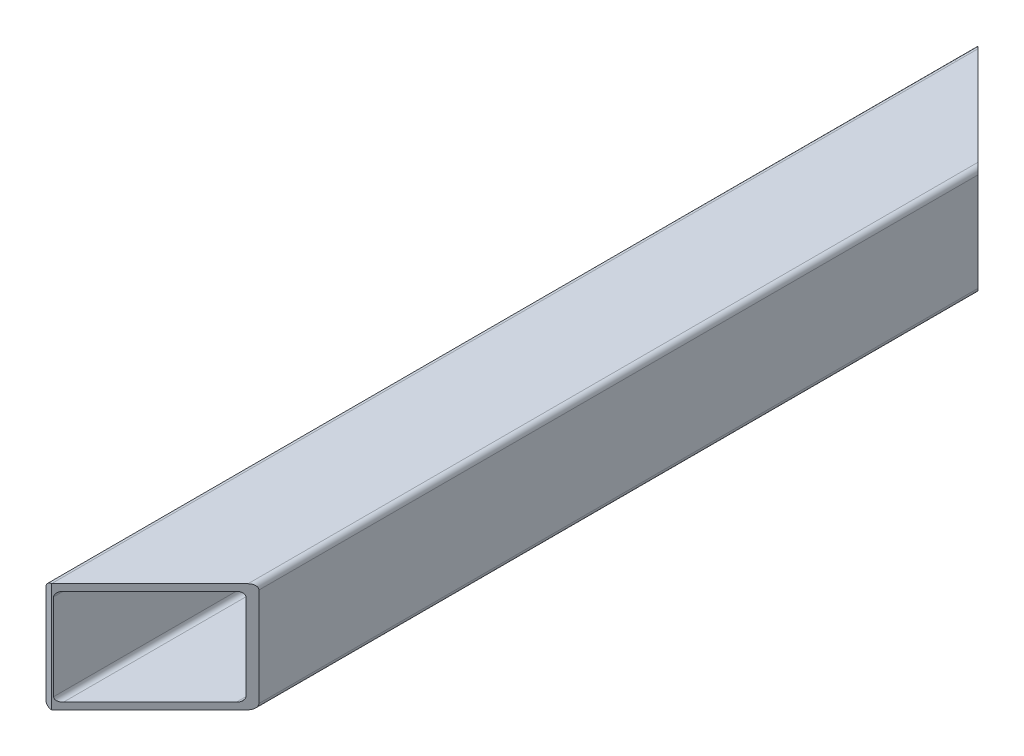
ISO-10303-21;
HEADER;
FILE_DESCRIPTION(('STEP AP214'),'2;1');
FILE_NAME('part.step','',(''),(''),'','','');
FILE_SCHEMA(('AUTOMOTIVE_DESIGN { 1 0 10303 214 1 1 1 1 }'));
ENDSEC;
DATA;
#1=APPLICATION_CONTEXT('core data for automotive mechanical design processes');
#2=APPLICATION_PROTOCOL_DEFINITION('international standard','automotive_design',2000,#1);
#3=PRODUCT_CONTEXT('',#1,'mechanical');
#4=PRODUCT('Part','Part','',(#3));
#5=PRODUCT_RELATED_PRODUCT_CATEGORY('part','',(#4));
#6=PRODUCT_DEFINITION_FORMATION('','',#4);
#7=PRODUCT_DEFINITION_CONTEXT('part definition',#1,'design');
#8=PRODUCT_DEFINITION('design','',#6,#7);
#9=PRODUCT_DEFINITION_SHAPE('','',#8);
#10=(LENGTH_UNIT() NAMED_UNIT(*) SI_UNIT(.MILLI.,.METRE.));
#11=(NAMED_UNIT(*) PLANE_ANGLE_UNIT() SI_UNIT($,.RADIAN.));
#12=(NAMED_UNIT(*) SI_UNIT($,.STERADIAN.) SOLID_ANGLE_UNIT());
#13=UNCERTAINTY_MEASURE_WITH_UNIT(LENGTH_MEASURE(1.E-05),#10,'distance_accuracy_value','');
#14=(GEOMETRIC_REPRESENTATION_CONTEXT(3) GLOBAL_UNCERTAINTY_ASSIGNED_CONTEXT((#13)) GLOBAL_UNIT_ASSIGNED_CONTEXT((#10,
#11,#12)) REPRESENTATION_CONTEXT('',''));
#15=CARTESIAN_POINT('',(0.,0.,0.));
#16=DIRECTION('',(0.,0.,1.));
#17=DIRECTION('',(1.,0.,0.));
#18=AXIS2_PLACEMENT_3D('',#15,#16,#17);
#19=CARTESIAN_POINT('',(22.352,20.1168,406.4));
#20=DIRECTION('',(-1.,0.,0.));
#21=DIRECTION('',(0.,0.,1.));
#22=AXIS2_PLACEMENT_3D('',#19,#20,#21);
#23=PLANE('',#22);
#24=DIRECTION('',(0.,-1.,0.));
#25=VECTOR('',#24,1.);
#26=CARTESIAN_POINT('',(22.352,20.1168,361.188));
#27=LINE('',#26,#25);
#28=CARTESIAN_POINT('',(22.352,20.1168,361.188));
#29=VERTEX_POINT('',#28);
#30=CARTESIAN_POINT('',(22.352,-20.1168,361.188));
#31=VERTEX_POINT('',#30);
#32=EDGE_CURVE('E11',#29,#31,#27,.T.);
#33=ORIENTED_EDGE('',*,*,#32,.F.);
#34=DIRECTION('',(0.,0.,-1.));
#35=VECTOR('',#34,1.);
#36=CARTESIAN_POINT('',(22.352,20.1168,406.4));
#37=LINE('',#36,#35);
#38=CARTESIAN_POINT('',(22.352,20.1168,20.5597061886813));
#39=VERTEX_POINT('',#38);
#40=EDGE_CURVE('E221',#29,#39,#37,.T.);
#41=ORIENTED_EDGE('',*,*,#40,.T.);
#42=DIRECTION('',(0.,1.,0.));
#43=VECTOR('',#42,1.);
#44=CARTESIAN_POINT('',(22.352,20.1168,20.5597061886813));
#45=LINE('',#44,#43);
#46=CARTESIAN_POINT('',(22.352,-20.1168,20.5597061886813));
#47=VERTEX_POINT('',#46);
#48=EDGE_CURVE('E25',#47,#39,#45,.T.);
#49=ORIENTED_EDGE('',*,*,#48,.F.);
#50=DIRECTION('',(0.,0.,-1.));
#51=VECTOR('',#50,1.);
#52=CARTESIAN_POINT('',(22.352,-20.1168,406.4));
#53=LINE('',#52,#51);
#54=EDGE_CURVE('E229',#31,#47,#53,.T.);
#55=ORIENTED_EDGE('',*,*,#54,.F.);
#56=EDGE_LOOP('',(#33,#41,#49,#55));
#57=FACE_BOUND('',#56,.T.);
#58=ADVANCED_FACE('F16',(#57),#23,.T.);
#59=CARTESIAN_POINT('',(20.1168,-20.1168,406.4));
#60=DIRECTION('',(0.,0.,-1.));
#61=DIRECTION('',(-1.,0.,0.));
#62=AXIS2_PLACEMENT_3D('',#59,#60,#61);
#63=CYLINDRICAL_SURFACE('',#62,2.2352);
#64=CARTESIAN_POINT('',(20.1168,-20.1168,363.4232));
#65=DIRECTION('',(-0.707106781186546,0.,-0.707106781186549));
#66=DIRECTION('',(0.707106781186549,0.,-0.707106781186546));
#67=AXIS2_PLACEMENT_3D('',#64,#65,#66);
#68=ELLIPSE('',#67,3.16105015461634,2.2352);
#69=CARTESIAN_POINT('',(20.1168,-22.352,363.4232));
#70=VERTEX_POINT('',#69);
#71=EDGE_CURVE('E303',#31,#70,#68,.T.);
#72=ORIENTED_EDGE('',*,*,#71,.F.);
#73=ORIENTED_EDGE('',*,*,#54,.T.);
#74=CARTESIAN_POINT('',(20.1168,-20.1168,18.3245061886812));
#75=DIRECTION('',(-0.707106781186546,0.,0.707106781186549));
#76=DIRECTION('',(-0.707106781186549,0.,-0.707106781186546));
#77=AXIS2_PLACEMENT_3D('',#74,#75,#76);
#78=ELLIPSE('',#77,3.16105015461634,2.2352);
#79=CARTESIAN_POINT('',(20.1168,-22.352,18.3245061886812));
#80=VERTEX_POINT('',#79);
#81=EDGE_CURVE('E40',#80,#47,#78,.T.);
#82=ORIENTED_EDGE('',*,*,#81,.F.);
#83=DIRECTION('',(0.,0.,-1.));
#84=VECTOR('',#83,1.);
#85=CARTESIAN_POINT('',(20.1168,-22.352,406.4));
#86=LINE('',#85,#84);
#87=EDGE_CURVE('E235',#70,#80,#86,.T.);
#88=ORIENTED_EDGE('',*,*,#87,.F.);
#89=EDGE_LOOP('',(#72,#73,#82,#88));
#90=FACE_BOUND('',#89,.T.);
#91=ADVANCED_FACE('F373',(#90),#63,.F.);
#92=CARTESIAN_POINT('',(20.1168,-22.352,406.4));
#93=DIRECTION('',(0.,1.,0.));
#94=DIRECTION('',(-1.,0.,0.));
#95=AXIS2_PLACEMENT_3D('',#92,#93,#94);
#96=PLANE('',#95);
#97=DIRECTION('',(-0.707106781186549,0.,0.707106781186546));
#98=VECTOR('',#97,1.);
#99=CARTESIAN_POINT('',(-1.37159999999993,-22.352,384.9116));
#100=LINE('',#99,#98);
#101=CARTESIAN_POINT('',(-20.1168,-22.352,403.6568));
#102=VERTEX_POINT('',#101);
#103=EDGE_CURVE('E306',#70,#102,#100,.T.);
#104=ORIENTED_EDGE('',*,*,#103,.F.);
#105=ORIENTED_EDGE('',*,*,#87,.T.);
#106=DIRECTION('',(0.707106781186549,0.,0.707106781186546));
#107=VECTOR('',#106,1.);
#108=CARTESIAN_POINT('',(214.154546905659,-22.352,212.36225309434));
#109=LINE('',#108,#107);
#110=CARTESIAN_POINT('',(-20.1168,-22.352,-21.9090938113186));
#111=VERTEX_POINT('',#110);
#112=EDGE_CURVE('E343',#111,#80,#109,.T.);
#113=ORIENTED_EDGE('',*,*,#112,.F.);
#114=DIRECTION('',(0.,0.,-1.));
#115=VECTOR('',#114,1.);
#116=CARTESIAN_POINT('',(-20.1168,-22.352,406.4));
#117=LINE('',#116,#115);
#118=EDGE_CURVE('E245',#102,#111,#117,.T.);
#119=ORIENTED_EDGE('',*,*,#118,.F.);
#120=EDGE_LOOP('',(#104,#105,#113,#119));
#121=FACE_BOUND('',#120,.T.);
#122=ADVANCED_FACE('F354',(#121),#96,.T.);
#123=CARTESIAN_POINT('',(-20.1168,-20.1168,406.4));
#124=DIRECTION('',(0.,0.,-1.));
#125=DIRECTION('',(-1.,0.,0.));
#126=AXIS2_PLACEMENT_3D('',#123,#124,#125);
#127=CYLINDRICAL_SURFACE('',#126,2.2352);
#128=CARTESIAN_POINT('',(-20.1168,-20.1168,403.6568));
#129=DIRECTION('',(-0.707106781186546,0.,-0.707106781186549));
#130=DIRECTION('',(0.707106781186549,0.,-0.707106781186546));
#131=AXIS2_PLACEMENT_3D('',#128,#129,#130);
#132=ELLIPSE('',#131,3.16105015461634,2.2352);
#133=CARTESIAN_POINT('',(-22.352,-20.1168,405.892));
#134=VERTEX_POINT('',#133);
#135=EDGE_CURVE('E309',#102,#134,#132,.T.);
#136=ORIENTED_EDGE('',*,*,#135,.F.);
#137=ORIENTED_EDGE('',*,*,#118,.T.);
#138=CARTESIAN_POINT('',(-20.1168,-20.1168,-21.9090938113186));
#139=DIRECTION('',(-0.707106781186546,0.,0.707106781186549));
#140=DIRECTION('',(-0.707106781186549,0.,-0.707106781186546));
#141=AXIS2_PLACEMENT_3D('',#138,#139,#140);
#142=ELLIPSE('',#141,3.16105015461634,2.2352);
#143=CARTESIAN_POINT('',(-22.352,-20.1168,-24.1442938113186));
#144=VERTEX_POINT('',#143);
#145=EDGE_CURVE('E279',#144,#111,#142,.T.);
#146=ORIENTED_EDGE('',*,*,#145,.F.);
#147=DIRECTION('',(0.,0.,-1.));
#148=VECTOR('',#147,1.);
#149=CARTESIAN_POINT('',(-22.352,-20.1168,406.4));
#150=LINE('',#149,#148);
#151=EDGE_CURVE('E249',#134,#144,#150,.T.);
#152=ORIENTED_EDGE('',*,*,#151,.F.);
#153=EDGE_LOOP('',(#136,#137,#146,#152));
#154=FACE_BOUND('',#153,.T.);
#155=ADVANCED_FACE('F357',(#154),#127,.F.);
#156=CARTESIAN_POINT('',(-22.352,20.1168,406.4));
#157=DIRECTION('',(1.,0.,0.));
#158=DIRECTION('',(0.,1.,0.));
#159=AXIS2_PLACEMENT_3D('',#156,#157,#158);
#160=PLANE('',#159);
#161=DIRECTION('',(0.,1.,0.));
#162=VECTOR('',#161,1.);
#163=CARTESIAN_POINT('',(-22.352,20.1168,405.892));
#164=LINE('',#163,#162);
#165=CARTESIAN_POINT('',(-22.352,20.1168,405.892));
#166=VERTEX_POINT('',#165);
#167=EDGE_CURVE('E312',#134,#166,#164,.T.);
#168=ORIENTED_EDGE('',*,*,#167,.F.);
#169=ORIENTED_EDGE('',*,*,#151,.T.);
#170=DIRECTION('',(0.,-1.,0.));
#171=VECTOR('',#170,1.);
#172=CARTESIAN_POINT('',(-22.352,20.1168,-24.1442938113185));
#173=LINE('',#172,#171);
#174=CARTESIAN_POINT('',(-22.352,20.1168,-24.1442938113185));
#175=VERTEX_POINT('',#174);
#176=EDGE_CURVE('E273',#175,#144,#173,.T.);
#177=ORIENTED_EDGE('',*,*,#176,.F.);
#178=DIRECTION('',(0.,0.,-1.));
#179=VECTOR('',#178,1.);
#180=CARTESIAN_POINT('',(-22.352,20.1168,406.4));
#181=LINE('',#180,#179);
#182=EDGE_CURVE('E253',#166,#175,#181,.T.);
#183=ORIENTED_EDGE('',*,*,#182,.F.);
#184=EDGE_LOOP('',(#168,#169,#177,#183));
#185=FACE_BOUND('',#184,.T.);
#186=ADVANCED_FACE('F361',(#185),#160,.T.);
#187=CARTESIAN_POINT('',(-20.1168,20.1168,406.4));
#188=DIRECTION('',(0.,0.,-1.));
#189=DIRECTION('',(-1.,0.,0.));
#190=AXIS2_PLACEMENT_3D('',#187,#188,#189);
#191=CYLINDRICAL_SURFACE('',#190,2.2352);
#192=CARTESIAN_POINT('',(-20.1168,20.1168,403.6568));
#193=DIRECTION('',(-0.707106781186546,0.,-0.707106781186549));
#194=DIRECTION('',(0.707106781186549,0.,-0.707106781186546));
#195=AXIS2_PLACEMENT_3D('',#192,#193,#194);
#196=ELLIPSE('',#195,3.16105015461635,2.2352);
#197=CARTESIAN_POINT('',(-20.1168,22.352,403.6568));
#198=VERTEX_POINT('',#197);
#199=EDGE_CURVE('E268',#166,#198,#196,.T.);
#200=ORIENTED_EDGE('',*,*,#199,.F.);
#201=ORIENTED_EDGE('',*,*,#182,.T.);
#202=CARTESIAN_POINT('',(-20.1168,20.1168,-21.9090938113186));
#203=DIRECTION('',(-0.707106781186546,0.,0.707106781186549));
#204=DIRECTION('',(-0.707106781186549,0.,-0.707106781186546));
#205=AXIS2_PLACEMENT_3D('',#202,#203,#204);
#206=ELLIPSE('',#205,3.16105015461635,2.2352);
#207=CARTESIAN_POINT('',(-20.1168,22.352,-21.9090938113186));
#208=VERTEX_POINT('',#207);
#209=EDGE_CURVE('E270',#208,#175,#206,.T.);
#210=ORIENTED_EDGE('',*,*,#209,.F.);
#211=DIRECTION('',(0.,0.,-1.));
#212=VECTOR('',#211,1.);
#213=CARTESIAN_POINT('',(-20.1168,22.352,406.4));
#214=LINE('',#213,#212);
#215=EDGE_CURVE('E178',#198,#208,#214,.T.);
#216=ORIENTED_EDGE('',*,*,#215,.F.);
#217=EDGE_LOOP('',(#200,#201,#210,#216));
#218=FACE_BOUND('',#217,.T.);
#219=ADVANCED_FACE('F267',(#218),#191,.F.);
#220=CARTESIAN_POINT('',(20.1168,22.352,406.4));
#221=DIRECTION('',(0.,-1.,0.));
#222=DIRECTION('',(0.,0.,-1.));
#223=AXIS2_PLACEMENT_3D('',#220,#221,#222);
#224=PLANE('',#223);
#225=DIRECTION('',(0.707106781186549,0.,-0.707106781186546));
#226=VECTOR('',#225,1.);
#227=CARTESIAN_POINT('',(-1.37159999999993,22.352,384.9116));
#228=LINE('',#227,#226);
#229=CARTESIAN_POINT('',(20.1168,22.352,363.4232));
#230=VERTEX_POINT('',#229);
#231=EDGE_CURVE('E263',#198,#230,#228,.T.);
#232=ORIENTED_EDGE('',*,*,#231,.F.);
#233=ORIENTED_EDGE('',*,*,#215,.T.);
#234=DIRECTION('',(-0.707106781186549,0.,-0.707106781186546));
#235=VECTOR('',#234,1.);
#236=CARTESIAN_POINT('',(214.154546905659,22.352,212.36225309434));
#237=LINE('',#236,#235);
#238=CARTESIAN_POINT('',(20.1168,22.352,18.3245061886812));
#239=VERTEX_POINT('',#238);
#240=EDGE_CURVE('E225',#239,#208,#237,.T.);
#241=ORIENTED_EDGE('',*,*,#240,.F.);
#242=DIRECTION('',(0.,0.,-1.));
#243=VECTOR('',#242,1.);
#244=CARTESIAN_POINT('',(20.1168,22.352,406.4));
#245=LINE('',#244,#243);
#246=EDGE_CURVE('E170',#230,#239,#245,.T.);
#247=ORIENTED_EDGE('',*,*,#246,.F.);
#248=EDGE_LOOP('',(#232,#233,#241,#247));
#249=FACE_BOUND('',#248,.T.);
#250=ADVANCED_FACE('F262',(#249),#224,.T.);
#251=CARTESIAN_POINT('',(20.1168,20.1168,406.4));
#252=DIRECTION('',(0.,0.,-1.));
#253=DIRECTION('',(-1.,0.,0.));
#254=AXIS2_PLACEMENT_3D('',#251,#252,#253);
#255=CYLINDRICAL_SURFACE('',#254,2.2352);
#256=CARTESIAN_POINT('',(20.1168,20.1168,363.4232));
#257=DIRECTION('',(-0.707106781186546,0.,-0.707106781186549));
#258=DIRECTION('',(0.707106781186549,0.,-0.707106781186546));
#259=AXIS2_PLACEMENT_3D('',#256,#257,#258);
#260=ELLIPSE('',#259,3.16105015461634,2.2352);
#261=EDGE_CURVE('E319',#230,#29,#260,.T.);
#262=ORIENTED_EDGE('',*,*,#261,.F.);
#263=ORIENTED_EDGE('',*,*,#246,.T.);
#264=CARTESIAN_POINT('',(20.1168,20.1168,18.3245061886812));
#265=DIRECTION('',(-0.707106781186546,0.,0.707106781186549));
#266=DIRECTION('',(-0.707106781186549,0.,-0.707106781186546));
#267=AXIS2_PLACEMENT_3D('',#264,#265,#266);
#268=ELLIPSE('',#267,3.16105015461634,2.2352);
#269=EDGE_CURVE('E211',#39,#239,#268,.T.);
#270=ORIENTED_EDGE('',*,*,#269,.F.);
#271=ORIENTED_EDGE('',*,*,#40,.F.);
#272=EDGE_LOOP('',(#262,#263,#270,#271));
#273=FACE_BOUND('',#272,.T.);
#274=ADVANCED_FACE('F220',(#273),#255,.F.);
#275=CARTESIAN_POINT('',(192.66614690566,-25.4,190.873853094341));
#276=DIRECTION('',(-0.707106781186546,0.,0.707106781186549));
#277=DIRECTION('',(0.707106781186549,0.,0.707106781186546));
#278=AXIS2_PLACEMENT_3D('',#275,#276,#277);
#279=PLANE('',#278);
#280=ORIENTED_EDGE('',*,*,#269,.T.);
#281=ORIENTED_EDGE('',*,*,#240,.T.);
#282=ORIENTED_EDGE('',*,*,#209,.T.);
#283=ORIENTED_EDGE('',*,*,#176,.T.);
#284=ORIENTED_EDGE('',*,*,#145,.T.);
#285=ORIENTED_EDGE('',*,*,#112,.T.);
#286=ORIENTED_EDGE('',*,*,#81,.T.);
#287=ORIENTED_EDGE('',*,*,#48,.T.);
#288=EDGE_LOOP('',(#280,#281,#282,#283,#284,#285,#286,#287));
#289=FACE_BOUND('',#288,.T.);
#290=DIRECTION('',(0.707106781186549,0.,0.707106781186546));
#291=VECTOR('',#290,1.);
#292=CARTESIAN_POINT('',(192.66614690566,-25.4,190.873853094341));
#293=LINE('',#292,#291);
#294=CARTESIAN_POINT('',(-22.86,-25.4,-24.6522938113185));
#295=VERTEX_POINT('',#294);
#296=CARTESIAN_POINT('',(22.86,-25.4,21.0677061886814));
#297=VERTEX_POINT('',#296);
#298=EDGE_CURVE('E140',#295,#297,#293,.T.);
#299=ORIENTED_EDGE('',*,*,#298,.F.);
#300=CARTESIAN_POINT('',(-22.86,-22.86,-24.6522938113185));
#301=DIRECTION('',(-0.707106781186546,0.,0.707106781186549));
#302=DIRECTION('',(-0.707106781186549,0.,-0.707106781186546));
#303=AXIS2_PLACEMENT_3D('',#300,#301,#302);
#304=ELLIPSE('',#303,3.59210244842765,2.54);
#305=CARTESIAN_POINT('',(-25.4,-22.86,-27.1922938113185));
#306=VERTEX_POINT('',#305);
#307=EDGE_CURVE('E224',#306,#295,#304,.T.);
#308=ORIENTED_EDGE('',*,*,#307,.F.);
#309=DIRECTION('',(0.,-1.,0.));
#310=VECTOR('',#309,1.);
#311=CARTESIAN_POINT('',(-25.4,-22.86,-27.1922938113185));
#312=LINE('',#311,#310);
#313=CARTESIAN_POINT('',(-25.4,22.86,-27.1922938113185));
#314=VERTEX_POINT('',#313);
#315=EDGE_CURVE('E286',#314,#306,#312,.T.);
#316=ORIENTED_EDGE('',*,*,#315,.F.);
#317=CARTESIAN_POINT('',(-22.86,22.86,-24.6522938113185));
#318=DIRECTION('',(-0.707106781186546,0.,0.707106781186549));
#319=DIRECTION('',(-0.707106781186549,0.,-0.707106781186546));
#320=AXIS2_PLACEMENT_3D('',#317,#318,#319);
#321=ELLIPSE('',#320,3.59210244842765,2.54);
#322=CARTESIAN_POINT('',(-22.86,25.4,-24.6522938113185));
#323=VERTEX_POINT('',#322);
#324=EDGE_CURVE('E290',#323,#314,#321,.T.);
#325=ORIENTED_EDGE('',*,*,#324,.F.);
#326=DIRECTION('',(0.707106781186549,0.,0.707106781186546));
#327=VECTOR('',#326,1.);
#328=CARTESIAN_POINT('',(192.66614690566,25.4,190.873853094341));
#329=LINE('',#328,#327);
#330=CARTESIAN_POINT('',(22.86,25.4,21.0677061886813));
#331=VERTEX_POINT('',#330);
#332=EDGE_CURVE('E141',#323,#331,#329,.T.);
#333=ORIENTED_EDGE('',*,*,#332,.T.);
#334=CARTESIAN_POINT('',(22.86,22.86,21.0677061886813));
#335=DIRECTION('',(-0.707106781186546,0.,0.707106781186549));
#336=DIRECTION('',(-0.707106781186549,0.,-0.707106781186546));
#337=AXIS2_PLACEMENT_3D('',#334,#335,#336);
#338=ELLIPSE('',#337,3.59210244842766,2.54);
#339=CARTESIAN_POINT('',(25.4,22.86,23.6077061886813));
#340=VERTEX_POINT('',#339);
#341=EDGE_CURVE('E293',#340,#331,#338,.T.);
#342=ORIENTED_EDGE('',*,*,#341,.F.);
#343=DIRECTION('',(0.,1.,0.));
#344=VECTOR('',#343,1.);
#345=CARTESIAN_POINT('',(25.4,-22.86,23.6077061886813));
#346=LINE('',#345,#344);
#347=CARTESIAN_POINT('',(25.4,-22.86,23.6077061886813));
#348=VERTEX_POINT('',#347);
#349=EDGE_CURVE('E297',#348,#340,#346,.T.);
#350=ORIENTED_EDGE('',*,*,#349,.F.);
#351=CARTESIAN_POINT('',(22.86,-22.86,21.0677061886813));
#352=DIRECTION('',(-0.707106781186546,0.,0.707106781186549));
#353=DIRECTION('',(-0.707106781186549,0.,-0.707106781186546));
#354=AXIS2_PLACEMENT_3D('',#351,#352,#353);
#355=ELLIPSE('',#354,3.59210244842766,2.54);
#356=EDGE_CURVE('E32',#297,#348,#355,.T.);
#357=ORIENTED_EDGE('',*,*,#356,.F.);
#358=EDGE_LOOP('',(#299,#308,#316,#325,#333,#342,#350,#357));
#359=FACE_BOUND('',#358,.T.);
#360=ADVANCED_FACE('F210',(#289,#359),#279,.F.);
#361=CARTESIAN_POINT('',(-22.86,-25.4,406.4));
#362=DIRECTION('',(-0.707106781186546,0.,-0.707106781186549));
#363=DIRECTION('',(-0.707106781186549,0.,0.707106781186546));
#364=AXIS2_PLACEMENT_3D('',#361,#362,#363);
#365=PLANE('',#364);
#366=ORIENTED_EDGE('',*,*,#261,.T.);
#367=ORIENTED_EDGE('',*,*,#32,.T.);
#368=ORIENTED_EDGE('',*,*,#71,.T.);
#369=ORIENTED_EDGE('',*,*,#103,.T.);
#370=ORIENTED_EDGE('',*,*,#135,.T.);
#371=ORIENTED_EDGE('',*,*,#167,.T.);
#372=ORIENTED_EDGE('',*,*,#199,.T.);
#373=ORIENTED_EDGE('',*,*,#231,.T.);
#374=EDGE_LOOP('',(#366,#367,#368,#369,#370,#371,#372,#373));
#375=FACE_BOUND('',#374,.T.);
#376=DIRECTION('',(0.,-1.,0.));
#377=VECTOR('',#376,1.);
#378=CARTESIAN_POINT('',(25.4,-22.86,358.14));
#379=LINE('',#378,#377);
#380=CARTESIAN_POINT('',(25.4,22.86,358.14));
#381=VERTEX_POINT('',#380);
#382=CARTESIAN_POINT('',(25.4,-22.86,358.14));
#383=VERTEX_POINT('',#382);
#384=EDGE_CURVE('E238',#381,#383,#379,.T.);
#385=ORIENTED_EDGE('',*,*,#384,.F.);
#386=CARTESIAN_POINT('',(22.86,22.86,360.68));
#387=DIRECTION('',(-0.707106781186546,0.,-0.707106781186549));
#388=DIRECTION('',(0.707106781186549,0.,-0.707106781186546));
#389=AXIS2_PLACEMENT_3D('',#386,#387,#388);
#390=ELLIPSE('',#389,3.59210244842766,2.54);
#391=CARTESIAN_POINT('',(22.86,25.4,360.68));
#392=VERTEX_POINT('',#391);
#393=EDGE_CURVE('E134',#392,#381,#390,.T.);
#394=ORIENTED_EDGE('',*,*,#393,.F.);
#395=DIRECTION('',(-0.707106781186549,0.,0.707106781186547));
#396=VECTOR('',#395,1.);
#397=CARTESIAN_POINT('',(-22.86,25.4,406.4));
#398=LINE('',#397,#396);
#399=CARTESIAN_POINT('',(-22.86,25.4,406.4));
#400=VERTEX_POINT('',#399);
#401=EDGE_CURVE('E128',#392,#400,#398,.T.);
#402=ORIENTED_EDGE('',*,*,#401,.T.);
#403=DIRECTION('',(0.,1.,0.));
#404=VECTOR('',#403,1.);
#405=CARTESIAN_POINT('',(-22.86,-25.4,406.4));
#406=LINE('',#405,#404);
#407=CARTESIAN_POINT('',(-22.86,-25.4,406.4));
#408=VERTEX_POINT('',#407);
#409=EDGE_CURVE('E131',#408,#400,#406,.T.);
#410=ORIENTED_EDGE('',*,*,#409,.F.);
#411=DIRECTION('',(-0.707106781186549,0.,0.707106781186547));
#412=VECTOR('',#411,1.);
#413=CARTESIAN_POINT('',(-22.86,-25.4,406.4));
#414=LINE('',#413,#412);
#415=CARTESIAN_POINT('',(22.86,-25.4,360.68));
#416=VERTEX_POINT('',#415);
#417=EDGE_CURVE('E153',#416,#408,#414,.T.);
#418=ORIENTED_EDGE('',*,*,#417,.F.);
#419=CARTESIAN_POINT('',(22.86,-22.86,360.68));
#420=DIRECTION('',(-0.707106781186546,0.,-0.707106781186549));
#421=DIRECTION('',(0.707106781186549,0.,-0.707106781186546));
#422=AXIS2_PLACEMENT_3D('',#419,#420,#421);
#423=ELLIPSE('',#422,3.59210244842766,2.54);
#424=EDGE_CURVE('E230',#383,#416,#423,.T.);
#425=ORIENTED_EDGE('',*,*,#424,.F.);
#426=EDGE_LOOP('',(#385,#394,#402,#410,#418,#425));
#427=FACE_BOUND('',#426,.T.);
#428=ADVANCED_FACE('F130',(#375,#427),#365,.F.);
#429=CARTESIAN_POINT('',(22.86,-22.86,406.4));
#430=DIRECTION('',(0.,0.,1.));
#431=DIRECTION('',(1.,0.,0.));
#432=AXIS2_PLACEMENT_3D('',#429,#430,#431);
#433=PLANE('',#432);
#434=ORIENTED_EDGE('',*,*,#409,.T.);
#435=CARTESIAN_POINT('',(-22.86,22.86,406.4));
#436=DIRECTION('',(0.,0.,1.));
#437=DIRECTION('',(1.,0.,0.));
#438=AXIS2_PLACEMENT_3D('',#435,#436,#437);
#439=CIRCLE('',#438,2.54);
#440=CARTESIAN_POINT('',(-25.4,22.86,406.4));
#441=VERTEX_POINT('',#440);
#442=EDGE_CURVE('E147',#400,#441,#439,.T.);
#443=ORIENTED_EDGE('',*,*,#442,.T.);
#444=DIRECTION('',(0.,-1.,0.));
#445=VECTOR('',#444,1.);
#446=CARTESIAN_POINT('',(-25.4,-22.86,406.4));
#447=LINE('',#446,#445);
#448=CARTESIAN_POINT('',(-25.4,-22.86,406.4));
#449=VERTEX_POINT('',#448);
#450=EDGE_CURVE('E169',#441,#449,#447,.T.);
#451=ORIENTED_EDGE('',*,*,#450,.T.);
#452=CARTESIAN_POINT('',(-22.86,-22.86,406.4));
#453=DIRECTION('',(0.,0.,1.));
#454=DIRECTION('',(1.,0.,0.));
#455=AXIS2_PLACEMENT_3D('',#452,#453,#454);
#456=CIRCLE('',#455,2.54);
#457=EDGE_CURVE('E150',#449,#408,#456,.T.);
#458=ORIENTED_EDGE('',*,*,#457,.T.);
#459=EDGE_LOOP('',(#434,#443,#451,#458));
#460=FACE_BOUND('',#459,.T.);
#461=ADVANCED_FACE('F145',(#460),#433,.T.);
#462=CARTESIAN_POINT('',(22.86,-22.86,406.4));
#463=DIRECTION('',(0.,0.,-1.));
#464=DIRECTION('',(-1.,0.,0.));
#465=AXIS2_PLACEMENT_3D('',#462,#463,#464);
#466=CYLINDRICAL_SURFACE('',#465,2.54);
#467=DIRECTION('',(0.,0.,-1.));
#468=VECTOR('',#467,1.);
#469=CARTESIAN_POINT('',(25.4,-22.86,406.4));
#470=LINE('',#469,#468);
#471=EDGE_CURVE('E204',#383,#348,#470,.T.);
#472=ORIENTED_EDGE('',*,*,#471,.F.);
#473=ORIENTED_EDGE('',*,*,#424,.T.);
#474=DIRECTION('',(0.,0.,-1.));
#475=VECTOR('',#474,1.);
#476=CARTESIAN_POINT('',(22.86,-25.4,406.4));
#477=LINE('',#476,#475);
#478=EDGE_CURVE('E184',#416,#297,#477,.T.);
#479=ORIENTED_EDGE('',*,*,#478,.T.);
#480=ORIENTED_EDGE('',*,*,#356,.T.);
#481=EDGE_LOOP('',(#472,#473,#479,#480));
#482=FACE_BOUND('',#481,.T.);
#483=ADVANCED_FACE('F18',(#482),#466,.T.);
#484=CARTESIAN_POINT('',(25.4,-22.86,406.4));
#485=DIRECTION('',(-1.,0.,0.));
#486=DIRECTION('',(0.,0.,1.));
#487=AXIS2_PLACEMENT_3D('',#484,#485,#486);
#488=PLANE('',#487);
#489=DIRECTION('',(0.,0.,-1.));
#490=VECTOR('',#489,1.);
#491=CARTESIAN_POINT('',(25.4,22.86,406.4));
#492=LINE('',#491,#490);
#493=EDGE_CURVE('E200',#381,#340,#492,.T.);
#494=ORIENTED_EDGE('',*,*,#493,.F.);
#495=ORIENTED_EDGE('',*,*,#384,.T.);
#496=ORIENTED_EDGE('',*,*,#471,.T.);
#497=ORIENTED_EDGE('',*,*,#349,.T.);
#498=EDGE_LOOP('',(#494,#495,#496,#497));
#499=FACE_BOUND('',#498,.T.);
#500=ADVANCED_FACE('F329',(#499),#488,.F.);
#501=CARTESIAN_POINT('',(22.86,22.86,406.4));
#502=DIRECTION('',(0.,0.,-1.));
#503=DIRECTION('',(-1.,0.,0.));
#504=AXIS2_PLACEMENT_3D('',#501,#502,#503);
#505=CYLINDRICAL_SURFACE('',#504,2.54);
#506=DIRECTION('',(0.,0.,-1.));
#507=VECTOR('',#506,1.);
#508=CARTESIAN_POINT('',(22.86,25.4,406.4));
#509=LINE('',#508,#507);
#510=EDGE_CURVE('E162',#392,#331,#509,.T.);
#511=ORIENTED_EDGE('',*,*,#510,.F.);
#512=ORIENTED_EDGE('',*,*,#393,.T.);
#513=ORIENTED_EDGE('',*,*,#493,.T.);
#514=ORIENTED_EDGE('',*,*,#341,.T.);
#515=EDGE_LOOP('',(#511,#512,#513,#514));
#516=FACE_BOUND('',#515,.T.);
#517=ADVANCED_FACE('F476',(#516),#505,.T.);
#518=CARTESIAN_POINT('',(22.86,25.4,406.4));
#519=DIRECTION('',(0.,-1.,0.));
#520=DIRECTION('',(1.,0.,0.));
#521=AXIS2_PLACEMENT_3D('',#518,#519,#520);
#522=PLANE('',#521);
#523=DIRECTION('',(0.,0.,-1.));
#524=VECTOR('',#523,1.);
#525=CARTESIAN_POINT('',(-22.86,25.4,406.4));
#526=LINE('',#525,#524);
#527=EDGE_CURVE('E157',#400,#323,#526,.T.);
#528=ORIENTED_EDGE('',*,*,#527,.F.);
#529=ORIENTED_EDGE('',*,*,#401,.F.);
#530=ORIENTED_EDGE('',*,*,#510,.T.);
#531=ORIENTED_EDGE('',*,*,#332,.F.);
#532=EDGE_LOOP('',(#528,#529,#530,#531));
#533=FACE_BOUND('',#532,.T.);
#534=ADVANCED_FACE('F158',(#533),#522,.F.);
#535=CARTESIAN_POINT('',(-22.86,22.86,406.4));
#536=DIRECTION('',(0.,0.,-1.));
#537=DIRECTION('',(-1.,0.,0.));
#538=AXIS2_PLACEMENT_3D('',#535,#536,#537);
#539=CYLINDRICAL_SURFACE('',#538,2.54);
#540=ORIENTED_EDGE('',*,*,#527,.T.);
#541=ORIENTED_EDGE('',*,*,#324,.T.);
#542=DIRECTION('',(0.,0.,-1.));
#543=VECTOR('',#542,1.);
#544=CARTESIAN_POINT('',(-25.4,22.86,406.4));
#545=LINE('',#544,#543);
#546=EDGE_CURVE('E163',#441,#314,#545,.T.);
#547=ORIENTED_EDGE('',*,*,#546,.F.);
#548=ORIENTED_EDGE('',*,*,#442,.F.);
#549=EDGE_LOOP('',(#540,#541,#547,#548));
#550=FACE_BOUND('',#549,.T.);
#551=ADVANCED_FACE('F165',(#550),#539,.T.);
#552=CARTESIAN_POINT('',(-25.4,-22.86,406.4));
#553=DIRECTION('',(1.,0.,0.));
#554=DIRECTION('',(0.,0.,-1.));
#555=AXIS2_PLACEMENT_3D('',#552,#553,#554);
#556=PLANE('',#555);
#557=ORIENTED_EDGE('',*,*,#546,.T.);
#558=ORIENTED_EDGE('',*,*,#315,.T.);
#559=DIRECTION('',(0.,0.,-1.));
#560=VECTOR('',#559,1.);
#561=CARTESIAN_POINT('',(-25.4,-22.86,406.4));
#562=LINE('',#561,#560);
#563=EDGE_CURVE('E192',#449,#306,#562,.T.);
#564=ORIENTED_EDGE('',*,*,#563,.F.);
#565=ORIENTED_EDGE('',*,*,#450,.F.);
#566=EDGE_LOOP('',(#557,#558,#564,#565));
#567=FACE_BOUND('',#566,.T.);
#568=ADVANCED_FACE('F498',(#567),#556,.F.);
#569=CARTESIAN_POINT('',(-22.86,-22.86,406.4));
#570=DIRECTION('',(0.,0.,-1.));
#571=DIRECTION('',(-1.,0.,0.));
#572=AXIS2_PLACEMENT_3D('',#569,#570,#571);
#573=CYLINDRICAL_SURFACE('',#572,2.54);
#574=ORIENTED_EDGE('',*,*,#563,.T.);
#575=ORIENTED_EDGE('',*,*,#307,.T.);
#576=DIRECTION('',(0.,0.,-1.));
#577=VECTOR('',#576,1.);
#578=CARTESIAN_POINT('',(-22.86,-25.4,406.4));
#579=LINE('',#578,#577);
#580=EDGE_CURVE('E188',#408,#295,#579,.T.);
#581=ORIENTED_EDGE('',*,*,#580,.F.);
#582=ORIENTED_EDGE('',*,*,#457,.F.);
#583=EDGE_LOOP('',(#574,#575,#581,#582));
#584=FACE_BOUND('',#583,.T.);
#585=ADVANCED_FACE('F506',(#584),#573,.T.);
#586=CARTESIAN_POINT('',(22.86,-25.4,406.4));
#587=DIRECTION('',(0.,1.,0.));
#588=DIRECTION('',(-1.,0.,0.));
#589=AXIS2_PLACEMENT_3D('',#586,#587,#588);
#590=PLANE('',#589);
#591=ORIENTED_EDGE('',*,*,#478,.F.);
#592=ORIENTED_EDGE('',*,*,#417,.T.);
#593=ORIENTED_EDGE('',*,*,#580,.T.);
#594=ORIENTED_EDGE('',*,*,#298,.T.);
#595=EDGE_LOOP('',(#591,#592,#593,#594));
#596=FACE_BOUND('',#595,.T.);
#597=ADVANCED_FACE('F333',(#596),#590,.F.);
#598=CLOSED_SHELL('',(#58,#91,#122,#155,#186,#219,#250,#274,#360,#428,#461,#483,#500,#517,#534,
#551,#568,#585,#597));
#599=MANIFOLD_SOLID_BREP('B1',#598);
#600=ADVANCED_BREP_SHAPE_REPRESENTATION('',(#18,#599),#14);
#601=SHAPE_DEFINITION_REPRESENTATION(#9,#600);
ENDSEC;
END-ISO-10303-21;
